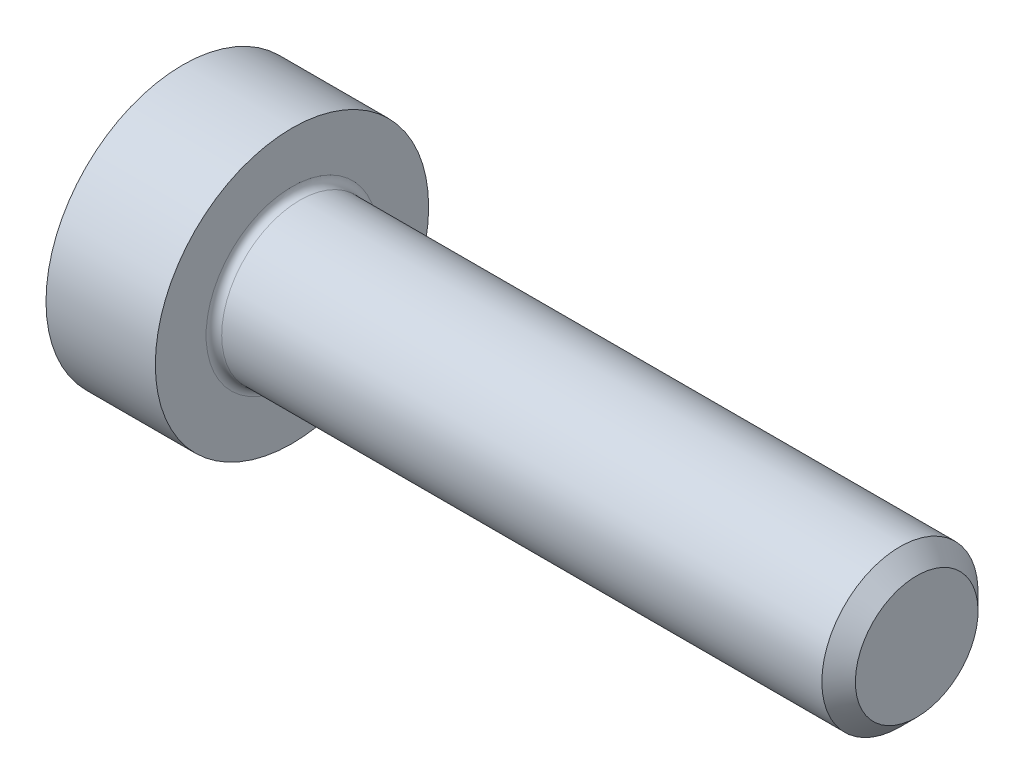
ISO-10303-21;
HEADER;
FILE_DESCRIPTION(('STEP AP214'),'2;1');
FILE_NAME('part.step','',(''),(''),'','','');
FILE_SCHEMA(('AUTOMOTIVE_DESIGN { 1 0 10303 214 1 1 1 1 }'));
ENDSEC;
DATA;
#1=APPLICATION_CONTEXT('core data for automotive mechanical design processes');
#2=APPLICATION_PROTOCOL_DEFINITION('international standard','automotive_design',2000,#1);
#3=PRODUCT_CONTEXT('',#1,'mechanical');
#4=PRODUCT('Part','Part','',(#3));
#5=PRODUCT_RELATED_PRODUCT_CATEGORY('part','',(#4));
#6=PRODUCT_DEFINITION_FORMATION('','',#4);
#7=PRODUCT_DEFINITION_CONTEXT('part definition',#1,'design');
#8=PRODUCT_DEFINITION('design','',#6,#7);
#9=PRODUCT_DEFINITION_SHAPE('','',#8);
#10=(LENGTH_UNIT() NAMED_UNIT(*) SI_UNIT(.MILLI.,.METRE.));
#11=(NAMED_UNIT(*) PLANE_ANGLE_UNIT() SI_UNIT($,.RADIAN.));
#12=(NAMED_UNIT(*) SI_UNIT($,.STERADIAN.) SOLID_ANGLE_UNIT());
#13=UNCERTAINTY_MEASURE_WITH_UNIT(LENGTH_MEASURE(1.E-05),#10,'distance_accuracy_value','');
#14=(GEOMETRIC_REPRESENTATION_CONTEXT(3) GLOBAL_UNCERTAINTY_ASSIGNED_CONTEXT((#13)) GLOBAL_UNIT_ASSIGNED_CONTEXT((#10,
#11,#12)) REPRESENTATION_CONTEXT('',''));
#15=CARTESIAN_POINT('',(0.,0.,0.));
#16=DIRECTION('',(0.,0.,1.));
#17=DIRECTION('',(1.,0.,0.));
#18=AXIS2_PLACEMENT_3D('',#15,#16,#17);
#19=CARTESIAN_POINT('',(-0.5,0.,0.));
#20=DIRECTION('',(1.,0.,0.));
#21=DIRECTION('',(0.,0.,-1.));
#22=AXIS2_PLACEMENT_3D('',#19,#20,#21);
#23=PLANE('',#22);
#24=CARTESIAN_POINT('',(-0.500000000001133,0.,0.));
#25=DIRECTION('',(-1.,0.,0.));
#26=DIRECTION('',(0.,-1.,0.));
#27=AXIS2_PLACEMENT_3D('',#24,#25,#26);
#28=CIRCLE('',#27,1.25000000002728);
#29=CARTESIAN_POINT('',(-0.500000000000567,1.08253175474236,-0.62500000000682));
#30=VERTEX_POINT('',#29);
#31=CARTESIAN_POINT('',(-0.500000000000567,1.08253175474236,0.62500000000682));
#32=VERTEX_POINT('',#31);
#33=EDGE_CURVE('E107',#30,#32,#28,.F.);
#34=ORIENTED_EDGE('',*,*,#33,.T.);
#35=DIRECTION('',(0.,0.5,-0.866025403784439));
#36=VECTOR('',#35,1.);
#37=CARTESIAN_POINT('',(-0.5,1.44337567297406,0.));
#38=LINE('',#37,#36);
#39=CARTESIAN_POINT('',(-0.5,1.44337567297406,0.));
#40=VERTEX_POINT('',#39);
#41=EDGE_CURVE('E86',#40,#32,#38,.F.);
#42=ORIENTED_EDGE('',*,*,#41,.F.);
#43=DIRECTION('',(0.,-0.5,-0.866025403784439));
#44=VECTOR('',#43,1.);
#45=CARTESIAN_POINT('',(-0.5,0.721687836487032,-1.25));
#46=LINE('',#45,#44);
#47=EDGE_CURVE('E108',#30,#40,#46,.F.);
#48=ORIENTED_EDGE('',*,*,#47,.F.);
#49=EDGE_LOOP('',(#34,#42,#48));
#50=FACE_BOUND('',#49,.T.);
#51=ADVANCED_FACE('F15',(#50),#23,.F.);
#52=CARTESIAN_POINT('',(-0.5,0.,0.));
#53=DIRECTION('',(1.,0.,0.));
#54=DIRECTION('',(0.,0.,-1.));
#55=AXIS2_PLACEMENT_3D('',#52,#53,#54);
#56=PLANE('',#55);
#57=DIRECTION('',(0.,-0.5,-0.866025403784439));
#58=VECTOR('',#57,1.);
#59=CARTESIAN_POINT('',(-0.5,0.721687836487032,-1.25));
#60=LINE('',#59,#58);
#61=CARTESIAN_POINT('',(-0.5,0.721687836487032,-1.25));
#62=VERTEX_POINT('',#61);
#63=EDGE_CURVE('E150',#62,#30,#60,.F.);
#64=ORIENTED_EDGE('',*,*,#63,.F.);
#65=DIRECTION('',(0.,1.,0.));
#66=VECTOR('',#65,1.);
#67=CARTESIAN_POINT('',(-0.5,-0.721687836487032,-1.25));
#68=LINE('',#67,#66);
#69=CARTESIAN_POINT('',(-0.500000000000567,0.,-1.25000000001364));
#70=VERTEX_POINT('',#69);
#71=EDGE_CURVE('E169',#70,#62,#68,.T.);
#72=ORIENTED_EDGE('',*,*,#71,.F.);
#73=CARTESIAN_POINT('',(-0.500000000001133,0.,0.));
#74=DIRECTION('',(-1.,0.,0.));
#75=DIRECTION('',(0.,-1.,0.));
#76=AXIS2_PLACEMENT_3D('',#73,#74,#75);
#77=CIRCLE('',#76,1.25000000002728);
#78=EDGE_CURVE('E112',#70,#30,#77,.F.);
#79=ORIENTED_EDGE('',*,*,#78,.T.);
#80=EDGE_LOOP('',(#64,#72,#79));
#81=FACE_BOUND('',#80,.T.);
#82=ADVANCED_FACE('F323',(#81),#56,.F.);
#83=CARTESIAN_POINT('',(-0.5,0.721687836487032,-1.25));
#84=DIRECTION('',(0.,-0.866025403784439,0.5));
#85=DIRECTION('',(0.,-0.5,-0.866025403784439));
#86=AXIS2_PLACEMENT_3D('',#83,#84,#85);
#87=PLANE('',#86);
#88=ORIENTED_EDGE('',*,*,#47,.T.);
#89=DIRECTION('',(1.,0.,0.));
#90=VECTOR('',#89,1.);
#91=CARTESIAN_POINT('',(-0.5,1.44337567297406,0.));
#92=LINE('',#91,#90);
#93=CARTESIAN_POINT('',(-2.8,1.44337567297406,0.));
#94=VERTEX_POINT('',#93);
#95=EDGE_CURVE('E94',#94,#40,#92,.T.);
#96=ORIENTED_EDGE('',*,*,#95,.F.);
#97=DIRECTION('',(0.,-0.5,-0.866025403784439));
#98=VECTOR('',#97,1.);
#99=CARTESIAN_POINT('',(-2.8,0.721687836487032,-1.25));
#100=LINE('',#99,#98);
#101=CARTESIAN_POINT('',(-2.8,0.721687836487032,-1.25));
#102=VERTEX_POINT('',#101);
#103=EDGE_CURVE('E147',#94,#102,#100,.T.);
#104=ORIENTED_EDGE('',*,*,#103,.T.);
#105=DIRECTION('',(1.,0.,0.));
#106=VECTOR('',#105,1.);
#107=CARTESIAN_POINT('',(-0.5,0.721687836487032,-1.25));
#108=LINE('',#107,#106);
#109=EDGE_CURVE('E165',#62,#102,#108,.F.);
#110=ORIENTED_EDGE('',*,*,#109,.F.);
#111=ORIENTED_EDGE('',*,*,#63,.T.);
#112=EDGE_LOOP('',(#88,#96,#104,#110,#111));
#113=FACE_BOUND('',#112,.T.);
#114=ADVANCED_FACE('F321',(#113),#87,.T.);
#115=CARTESIAN_POINT('',(-0.5,1.44337567297406,0.));
#116=DIRECTION('',(0.,-0.866025403784439,-0.5));
#117=DIRECTION('',(0.,0.5,-0.866025403784439));
#118=AXIS2_PLACEMENT_3D('',#115,#116,#117);
#119=PLANE('',#118);
#120=DIRECTION('',(0.,-0.500000000000002,0.866025403784437));
#121=VECTOR('',#120,1.);
#122=CARTESIAN_POINT('',(-0.5,1.08253175473055,0.625));
#123=LINE('',#122,#121);
#124=CARTESIAN_POINT('',(-0.5,0.721687836487032,1.25));
#125=VERTEX_POINT('',#124);
#126=EDGE_CURVE('E90',#32,#125,#123,.T.);
#127=ORIENTED_EDGE('',*,*,#126,.T.);
#128=DIRECTION('',(-1.,0.,0.));
#129=VECTOR('',#128,1.);
#130=CARTESIAN_POINT('',(-0.5,0.721687836487032,1.25));
#131=LINE('',#130,#129);
#132=CARTESIAN_POINT('',(-2.8,0.721687836487031,1.25));
#133=VERTEX_POINT('',#132);
#134=EDGE_CURVE('E179',#133,#125,#131,.F.);
#135=ORIENTED_EDGE('',*,*,#134,.F.);
#136=DIRECTION('',(0.,0.5,-0.866025403784439));
#137=VECTOR('',#136,1.);
#138=CARTESIAN_POINT('',(-2.8,1.44337567297406,0.));
#139=LINE('',#138,#137);
#140=EDGE_CURVE('E154',#133,#94,#139,.T.);
#141=ORIENTED_EDGE('',*,*,#140,.T.);
#142=ORIENTED_EDGE('',*,*,#95,.T.);
#143=ORIENTED_EDGE('',*,*,#41,.T.);
#144=EDGE_LOOP('',(#127,#135,#141,#142,#143));
#145=FACE_BOUND('',#144,.T.);
#146=ADVANCED_FACE('F88',(#145),#119,.T.);
#147=CARTESIAN_POINT('',(-0.5,0.,0.));
#148=DIRECTION('',(1.,0.,0.));
#149=DIRECTION('',(0.,0.,-1.));
#150=AXIS2_PLACEMENT_3D('',#147,#148,#149);
#151=PLANE('',#150);
#152=DIRECTION('',(0.,1.,0.));
#153=VECTOR('',#152,1.);
#154=CARTESIAN_POINT('',(-0.5,0.721687836487032,1.25));
#155=LINE('',#154,#153);
#156=CARTESIAN_POINT('',(-0.500000000000567,0.,1.25000000001364));
#157=VERTEX_POINT('',#156);
#158=EDGE_CURVE('E103',#125,#157,#155,.F.);
#159=ORIENTED_EDGE('',*,*,#158,.F.);
#160=ORIENTED_EDGE('',*,*,#126,.F.);
#161=CARTESIAN_POINT('',(-0.500000000001133,0.,0.));
#162=DIRECTION('',(-1.,0.,0.));
#163=DIRECTION('',(0.,-1.,0.));
#164=AXIS2_PLACEMENT_3D('',#161,#162,#163);
#165=CIRCLE('',#164,1.25000000002728);
#166=EDGE_CURVE('E18',#32,#157,#165,.F.);
#167=ORIENTED_EDGE('',*,*,#166,.T.);
#168=EDGE_LOOP('',(#159,#160,#167));
#169=FACE_BOUND('',#168,.T.);
#170=ADVANCED_FACE('F100',(#169),#151,.F.);
#171=CARTESIAN_POINT('',(-0.499999999959755,0.,0.));
#172=DIRECTION('',(-1.,0.,0.));
#173=DIRECTION('',(0.,-1.,0.));
#174=AXIS2_PLACEMENT_3D('',#171,#172,#173);
#175=CONICAL_SURFACE('',#174,1.2499999999136,1.2217304762672);
#176=CARTESIAN_POINT('',(-0.0450372071156835,1.13686837721616E-10,0.));
#177=VERTEX_POINT('',#176);
#178=VERTEX_LOOP('',#177);
#179=FACE_BOUND('',#178,.T.);
#180=ORIENTED_EDGE('',*,*,#78,.F.);
#181=CARTESIAN_POINT('',(-0.500000000001133,0.,0.));
#182=DIRECTION('',(-1.,0.,0.));
#183=DIRECTION('',(0.,-1.,0.));
#184=AXIS2_PLACEMENT_3D('',#181,#182,#183);
#185=CIRCLE('',#184,1.25000000002728);
#186=CARTESIAN_POINT('',(-0.500000000000567,-1.08253175474236,-0.62500000000682));
#187=VERTEX_POINT('',#186);
#188=EDGE_CURVE('E111',#70,#187,#185,.T.);
#189=ORIENTED_EDGE('',*,*,#188,.T.);
#190=CARTESIAN_POINT('',(-0.500000000001133,0.,0.));
#191=DIRECTION('',(-1.,0.,0.));
#192=DIRECTION('',(0.,-1.,0.));
#193=AXIS2_PLACEMENT_3D('',#190,#191,#192);
#194=CIRCLE('',#193,1.25000000002728);
#195=CARTESIAN_POINT('',(-0.500000000000567,-1.08253175474236,0.62500000000682));
#196=VERTEX_POINT('',#195);
#197=EDGE_CURVE('E126',#187,#196,#194,.T.);
#198=ORIENTED_EDGE('',*,*,#197,.T.);
#199=CARTESIAN_POINT('',(-0.500000000001133,0.,0.));
#200=DIRECTION('',(-1.,0.,0.));
#201=DIRECTION('',(0.,-1.,0.));
#202=AXIS2_PLACEMENT_3D('',#199,#200,#201);
#203=CIRCLE('',#202,1.25000000002728);
#204=EDGE_CURVE('E117',#196,#157,#203,.T.);
#205=ORIENTED_EDGE('',*,*,#204,.T.);
#206=ORIENTED_EDGE('',*,*,#166,.F.);
#207=ORIENTED_EDGE('',*,*,#33,.F.);
#208=EDGE_LOOP('',(#180,#189,#198,#205,#206,#207));
#209=FACE_BOUND('',#208,.T.);
#210=ADVANCED_FACE('F115',(#179,#209),#175,.F.);
#211=CARTESIAN_POINT('',(-0.5,0.,0.));
#212=DIRECTION('',(1.,0.,0.));
#213=DIRECTION('',(0.,0.,-1.));
#214=AXIS2_PLACEMENT_3D('',#211,#212,#213);
#215=PLANE('',#214);
#216=DIRECTION('',(0.,1.,0.));
#217=VECTOR('',#216,1.);
#218=CARTESIAN_POINT('',(-0.5,-0.721687836487032,-1.25));
#219=LINE('',#218,#217);
#220=CARTESIAN_POINT('',(-0.5,-0.721687836487029,-1.25));
#221=VERTEX_POINT('',#220);
#222=EDGE_CURVE('E144',#221,#70,#219,.T.);
#223=ORIENTED_EDGE('',*,*,#222,.F.);
#224=DIRECTION('',(0.,-0.5,0.866025403784439));
#225=VECTOR('',#224,1.);
#226=CARTESIAN_POINT('',(-0.5,-1.44337567297406,0.));
#227=LINE('',#226,#225);
#228=EDGE_CURVE('E195',#187,#221,#227,.F.);
#229=ORIENTED_EDGE('',*,*,#228,.F.);
#230=ORIENTED_EDGE('',*,*,#188,.F.);
#231=EDGE_LOOP('',(#223,#229,#230));
#232=FACE_BOUND('',#231,.T.);
#233=ADVANCED_FACE('F309',(#232),#215,.F.);
#234=CARTESIAN_POINT('',(-0.5,-0.721687836487032,-1.25));
#235=DIRECTION('',(0.,0.,1.));
#236=DIRECTION('',(1.,0.,0.));
#237=AXIS2_PLACEMENT_3D('',#234,#235,#236);
#238=PLANE('',#237);
#239=ORIENTED_EDGE('',*,*,#71,.T.);
#240=ORIENTED_EDGE('',*,*,#109,.T.);
#241=DIRECTION('',(0.,1.,0.));
#242=VECTOR('',#241,1.);
#243=CARTESIAN_POINT('',(-2.8,-0.721687836487032,-1.25));
#244=LINE('',#243,#242);
#245=CARTESIAN_POINT('',(-2.8,-0.721687836487031,-1.25));
#246=VERTEX_POINT('',#245);
#247=EDGE_CURVE('E124',#102,#246,#244,.F.);
#248=ORIENTED_EDGE('',*,*,#247,.T.);
#249=DIRECTION('',(1.,0.,0.));
#250=VECTOR('',#249,1.);
#251=CARTESIAN_POINT('',(-0.5,-0.721687836487029,-1.25));
#252=LINE('',#251,#250);
#253=EDGE_CURVE('E192',#221,#246,#252,.F.);
#254=ORIENTED_EDGE('',*,*,#253,.F.);
#255=ORIENTED_EDGE('',*,*,#222,.T.);
#256=EDGE_LOOP('',(#239,#240,#248,#254,#255));
#257=FACE_BOUND('',#256,.T.);
#258=ADVANCED_FACE('F305',(#257),#238,.T.);
#259=CARTESIAN_POINT('',(-0.5,0.721687836487032,1.25));
#260=DIRECTION('',(0.,0.,-1.));
#261=DIRECTION('',(-1.,0.,0.));
#262=AXIS2_PLACEMENT_3D('',#259,#260,#261);
#263=PLANE('',#262);
#264=DIRECTION('',(0.,1.,0.));
#265=VECTOR('',#264,1.);
#266=CARTESIAN_POINT('',(-0.5,0.,1.25));
#267=LINE('',#266,#265);
#268=CARTESIAN_POINT('',(-0.5,-0.721687836487032,1.25));
#269=VERTEX_POINT('',#268);
#270=EDGE_CURVE('E127',#157,#269,#267,.F.);
#271=ORIENTED_EDGE('',*,*,#270,.T.);
#272=DIRECTION('',(1.,0.,0.));
#273=VECTOR('',#272,1.);
#274=CARTESIAN_POINT('',(-0.5,-0.721687836487032,1.25));
#275=LINE('',#274,#273);
#276=CARTESIAN_POINT('',(-2.8,-0.721687836487032,1.25));
#277=VERTEX_POINT('',#276);
#278=EDGE_CURVE('E194',#277,#269,#275,.T.);
#279=ORIENTED_EDGE('',*,*,#278,.F.);
#280=DIRECTION('',(0.,1.,0.));
#281=VECTOR('',#280,1.);
#282=CARTESIAN_POINT('',(-2.8,0.721687836487032,1.25));
#283=LINE('',#282,#281);
#284=EDGE_CURVE('E168',#277,#133,#283,.T.);
#285=ORIENTED_EDGE('',*,*,#284,.T.);
#286=ORIENTED_EDGE('',*,*,#134,.T.);
#287=ORIENTED_EDGE('',*,*,#158,.T.);
#288=EDGE_LOOP('',(#271,#279,#285,#286,#287));
#289=FACE_BOUND('',#288,.T.);
#290=ADVANCED_FACE('F301',(#289),#263,.T.);
#291=CARTESIAN_POINT('',(-0.5,0.,0.));
#292=DIRECTION('',(1.,0.,0.));
#293=DIRECTION('',(0.,0.,-1.));
#294=AXIS2_PLACEMENT_3D('',#291,#292,#293);
#295=PLANE('',#294);
#296=DIRECTION('',(0.,0.5,0.866025403784439));
#297=VECTOR('',#296,1.);
#298=CARTESIAN_POINT('',(-0.5,-0.721687836487032,1.25));
#299=LINE('',#298,#297);
#300=EDGE_CURVE('E214',#269,#196,#299,.F.);
#301=ORIENTED_EDGE('',*,*,#300,.F.);
#302=ORIENTED_EDGE('',*,*,#270,.F.);
#303=ORIENTED_EDGE('',*,*,#204,.F.);
#304=EDGE_LOOP('',(#301,#302,#303));
#305=FACE_BOUND('',#304,.T.);
#306=ADVANCED_FACE('F297',(#305),#295,.F.);
#307=CARTESIAN_POINT('',(-0.5,0.,0.));
#308=DIRECTION('',(1.,0.,0.));
#309=DIRECTION('',(0.,0.,-1.));
#310=AXIS2_PLACEMENT_3D('',#307,#308,#309);
#311=PLANE('',#310);
#312=DIRECTION('',(0.,-0.5,0.866025403784439));
#313=VECTOR('',#312,1.);
#314=CARTESIAN_POINT('',(-0.5,-1.44337567297406,0.));
#315=LINE('',#314,#313);
#316=CARTESIAN_POINT('',(-0.5,-1.44337567297406,0.));
#317=VERTEX_POINT('',#316);
#318=EDGE_CURVE('E200',#317,#187,#315,.F.);
#319=ORIENTED_EDGE('',*,*,#318,.F.);
#320=DIRECTION('',(0.,0.5,0.866025403784439));
#321=VECTOR('',#320,1.);
#322=CARTESIAN_POINT('',(-0.5,-0.721687836487032,1.25));
#323=LINE('',#322,#321);
#324=EDGE_CURVE('E225',#196,#317,#323,.F.);
#325=ORIENTED_EDGE('',*,*,#324,.F.);
#326=ORIENTED_EDGE('',*,*,#197,.F.);
#327=EDGE_LOOP('',(#319,#325,#326));
#328=FACE_BOUND('',#327,.T.);
#329=ADVANCED_FACE('F294',(#328),#311,.F.);
#330=CARTESIAN_POINT('',(-0.5,-1.44337567297406,0.));
#331=DIRECTION('',(0.,0.866025403784439,0.5));
#332=DIRECTION('',(0.,-0.5,0.866025403784439));
#333=AXIS2_PLACEMENT_3D('',#330,#331,#332);
#334=PLANE('',#333);
#335=ORIENTED_EDGE('',*,*,#228,.T.);
#336=ORIENTED_EDGE('',*,*,#253,.T.);
#337=DIRECTION('',(0.,-0.5,0.866025403784439));
#338=VECTOR('',#337,1.);
#339=CARTESIAN_POINT('',(-2.8,-1.44337567297406,0.));
#340=LINE('',#339,#338);
#341=CARTESIAN_POINT('',(-2.8,-1.44337567297406,0.));
#342=VERTEX_POINT('',#341);
#343=EDGE_CURVE('E33',#246,#342,#340,.T.);
#344=ORIENTED_EDGE('',*,*,#343,.T.);
#345=DIRECTION('',(1.,0.,0.));
#346=VECTOR('',#345,1.);
#347=CARTESIAN_POINT('',(-0.5,-1.44337567297406,0.));
#348=LINE('',#347,#346);
#349=EDGE_CURVE('E205',#317,#342,#348,.F.);
#350=ORIENTED_EDGE('',*,*,#349,.F.);
#351=ORIENTED_EDGE('',*,*,#318,.T.);
#352=EDGE_LOOP('',(#335,#336,#344,#350,#351));
#353=FACE_BOUND('',#352,.T.);
#354=ADVANCED_FACE('F290',(#353),#334,.T.);
#355=CARTESIAN_POINT('',(-0.5,-0.721687836487032,1.25));
#356=DIRECTION('',(0.,0.866025403784439,-0.5));
#357=DIRECTION('',(0.,0.5,0.866025403784439));
#358=AXIS2_PLACEMENT_3D('',#355,#356,#357);
#359=PLANE('',#358);
#360=ORIENTED_EDGE('',*,*,#324,.T.);
#361=ORIENTED_EDGE('',*,*,#349,.T.);
#362=DIRECTION('',(0.,0.499999999999998,0.86602540378444));
#363=VECTOR('',#362,1.);
#364=CARTESIAN_POINT('',(-2.8,-1.44337567297406,0.));
#365=LINE('',#364,#363);
#366=EDGE_CURVE('E133',#342,#277,#365,.T.);
#367=ORIENTED_EDGE('',*,*,#366,.T.);
#368=ORIENTED_EDGE('',*,*,#278,.T.);
#369=ORIENTED_EDGE('',*,*,#300,.T.);
#370=EDGE_LOOP('',(#360,#361,#367,#368,#369));
#371=FACE_BOUND('',#370,.T.);
#372=ADVANCED_FACE('F286',(#371),#359,.T.);
#373=CARTESIAN_POINT('',(-2.8,0.,0.));
#374=DIRECTION('',(1.,0.,0.));
#375=DIRECTION('',(0.,0.,-1.));
#376=AXIS2_PLACEMENT_3D('',#373,#374,#375);
#377=PLANE('',#376);
#378=ORIENTED_EDGE('',*,*,#343,.F.);
#379=ORIENTED_EDGE('',*,*,#247,.F.);
#380=ORIENTED_EDGE('',*,*,#103,.F.);
#381=ORIENTED_EDGE('',*,*,#140,.F.);
#382=ORIENTED_EDGE('',*,*,#284,.F.);
#383=ORIENTED_EDGE('',*,*,#366,.F.);
#384=EDGE_LOOP('',(#378,#379,#380,#381,#382,#383));
#385=FACE_BOUND('',#384,.T.);
#386=CARTESIAN_POINT('',(-2.8,0.,0.));
#387=DIRECTION('',(-1.,0.,0.));
#388=DIRECTION('',(0.,0.,1.));
#389=AXIS2_PLACEMENT_3D('',#386,#387,#388);
#390=CIRCLE('',#389,3.5);
#391=CARTESIAN_POINT('',(-2.8,0.,3.5));
#392=VERTEX_POINT('',#391);
#393=EDGE_CURVE('E129',#392,#392,#390,.F.);
#394=ORIENTED_EDGE('',*,*,#393,.F.);
#395=EDGE_LOOP('',(#394));
#396=FACE_BOUND('',#395,.T.);
#397=ADVANCED_FACE('F282',(#385,#396),#377,.F.);
#398=CARTESIAN_POINT('',(16.,0.,0.));
#399=DIRECTION('',(-1.,0.,0.));
#400=DIRECTION('',(0.,0.,1.));
#401=AXIS2_PLACEMENT_3D('',#398,#399,#400);
#402=CYLINDRICAL_SURFACE('',#401,3.5);
#403=ORIENTED_EDGE('',*,*,#393,.T.);
#404=EDGE_LOOP('',(#403));
#405=FACE_BOUND('',#404,.T.);
#406=CARTESIAN_POINT('',(0.,0.,0.));
#407=DIRECTION('',(-1.,0.,0.));
#408=DIRECTION('',(0.,0.,1.));
#409=AXIS2_PLACEMENT_3D('',#406,#407,#408);
#410=CIRCLE('',#409,3.5);
#411=CARTESIAN_POINT('',(0.,0.,3.5));
#412=VERTEX_POINT('',#411);
#413=EDGE_CURVE('E132',#412,#412,#410,.T.);
#414=ORIENTED_EDGE('',*,*,#413,.T.);
#415=EDGE_LOOP('',(#414));
#416=FACE_BOUND('',#415,.T.);
#417=ADVANCED_FACE('F278',(#405,#416),#402,.T.);
#418=CARTESIAN_POINT('',(16.,1.5705,0.));
#419=DIRECTION('',(-1.,0.,0.));
#420=DIRECTION('',(0.,0.,1.));
#421=AXIS2_PLACEMENT_3D('',#418,#419,#420);
#422=PLANE('',#421);
#423=CARTESIAN_POINT('',(15.9999999999627,0.,0.));
#424=DIRECTION('',(-1.,0.,0.));
#425=DIRECTION('',(0.,-1.,0.));
#426=AXIS2_PLACEMENT_3D('',#423,#424,#425);
#427=CIRCLE('',#426,1.57050000001391);
#428=CARTESIAN_POINT('',(15.9999999999627,-1.57050000001391,0.));
#429=VERTEX_POINT('',#428);
#430=EDGE_CURVE('E136',#429,#429,#427,.T.);
#431=ORIENTED_EDGE('',*,*,#430,.F.);
#432=EDGE_LOOP('',(#431));
#433=FACE_BOUND('',#432,.T.);
#434=ADVANCED_FACE('F274',(#433),#422,.F.);
#435=CARTESIAN_POINT('',(0.,3.5,0.));
#436=DIRECTION('',(-1.,0.,0.));
#437=DIRECTION('',(0.,0.,1.));
#438=AXIS2_PLACEMENT_3D('',#435,#436,#437);
#439=PLANE('',#438);
#440=ORIENTED_EDGE('',*,*,#413,.F.);
#441=EDGE_LOOP('',(#440));
#442=FACE_BOUND('',#441,.T.);
#443=CARTESIAN_POINT('',(0.,0.,0.));
#444=DIRECTION('',(1.,0.,0.));
#445=DIRECTION('',(0.,0.,-1.));
#446=AXIS2_PLACEMENT_3D('',#443,#444,#445);
#447=CIRCLE('',#446,2.2);
#448=CARTESIAN_POINT('',(0.,0.,-2.2));
#449=VERTEX_POINT('',#448);
#450=EDGE_CURVE('E139',#449,#449,#447,.F.);
#451=ORIENTED_EDGE('',*,*,#450,.T.);
#452=EDGE_LOOP('',(#451));
#453=FACE_BOUND('',#452,.T.);
#454=ADVANCED_FACE('F265',(#442,#453),#439,.F.);
#455=CARTESIAN_POINT('',(15.5705000001944,0.,0.));
#456=DIRECTION('',(-1.,0.,0.));
#457=DIRECTION('',(0.,-1.,0.));
#458=AXIS2_PLACEMENT_3D('',#455,#456,#457);
#459=CONICAL_SURFACE('',#458,1.99999999983902,0.785398163463622);
#460=CARTESIAN_POINT('',(15.5705,0.,0.));
#461=DIRECTION('',(-1.,0.,0.));
#462=DIRECTION('',(0.,0.,1.));
#463=AXIS2_PLACEMENT_3D('',#460,#461,#462);
#464=CIRCLE('',#463,2.);
#465=CARTESIAN_POINT('',(15.5705,0.,2.));
#466=VERTEX_POINT('',#465);
#467=EDGE_CURVE('E24',#466,#466,#464,.T.);
#468=ORIENTED_EDGE('',*,*,#467,.F.);
#469=EDGE_LOOP('',(#468));
#470=FACE_BOUND('',#469,.T.);
#471=ORIENTED_EDGE('',*,*,#430,.T.);
#472=EDGE_LOOP('',(#471));
#473=FACE_BOUND('',#472,.T.);
#474=ADVANCED_FACE('F253',(#470,#473),#459,.T.);
#475=CARTESIAN_POINT('',(0.2,0.,0.));
#476=DIRECTION('',(1.,0.,0.));
#477=DIRECTION('',(0.,0.,-1.));
#478=AXIS2_PLACEMENT_3D('',#475,#476,#477);
#479=TOROIDAL_SURFACE('',#478,2.2,0.2);
#480=ORIENTED_EDGE('',*,*,#450,.F.);
#481=EDGE_LOOP('',(#480));
#482=FACE_BOUND('',#481,.T.);
#483=CARTESIAN_POINT('',(0.199999999999999,0.,0.));
#484=DIRECTION('',(-1.,0.,0.));
#485=DIRECTION('',(0.,0.,1.));
#486=AXIS2_PLACEMENT_3D('',#483,#484,#485);
#487=CIRCLE('',#486,2.);
#488=CARTESIAN_POINT('',(0.199999999999999,0.,2.));
#489=VERTEX_POINT('',#488);
#490=EDGE_CURVE('E10',#489,#489,#487,.F.);
#491=ORIENTED_EDGE('',*,*,#490,.F.);
#492=EDGE_LOOP('',(#491));
#493=FACE_BOUND('',#492,.T.);
#494=ADVANCED_FACE('F241',(#482,#493),#479,.F.);
#495=CARTESIAN_POINT('',(16.,0.,0.));
#496=DIRECTION('',(-1.,0.,0.));
#497=DIRECTION('',(0.,0.,1.));
#498=AXIS2_PLACEMENT_3D('',#495,#496,#497);
#499=CYLINDRICAL_SURFACE('',#498,2.);
#500=ORIENTED_EDGE('',*,*,#490,.T.);
#501=EDGE_LOOP('',(#500));
#502=FACE_BOUND('',#501,.T.);
#503=ORIENTED_EDGE('',*,*,#467,.T.);
#504=EDGE_LOOP('',(#503));
#505=FACE_BOUND('',#504,.T.);
#506=ADVANCED_FACE('F252',(#502,#505),#499,.T.);
#507=CLOSED_SHELL('',(#51,#82,#114,#146,#170,#210,#233,#258,#290,#306,#329,#354,#372,#397,#417,
#434,#454,#474,#494,#506));
#508=MANIFOLD_SOLID_BREP('B1',#507);
#509=ADVANCED_BREP_SHAPE_REPRESENTATION('',(#18,#508),#14);
#510=SHAPE_DEFINITION_REPRESENTATION(#9,#509);
ENDSEC;
END-ISO-10303-21;
